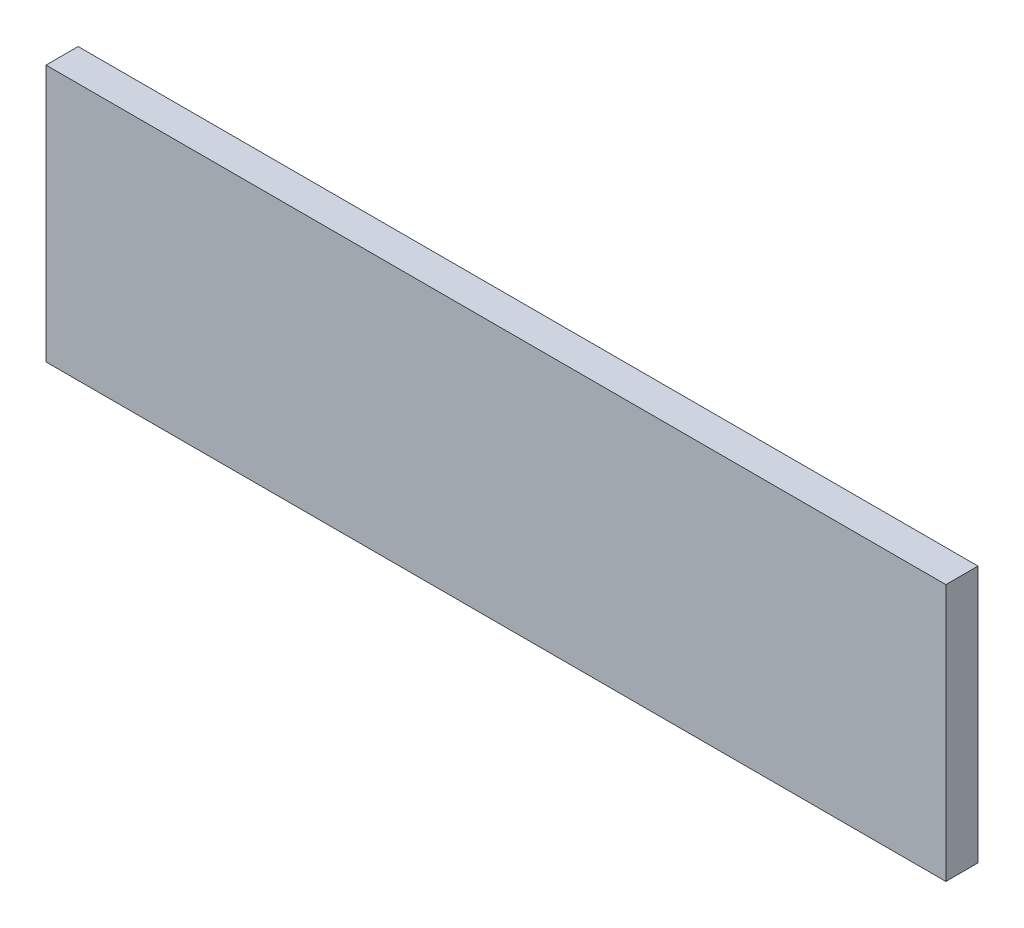
ISO-10303-21;
HEADER;
FILE_DESCRIPTION(('STEP AP214'),'2;1');
FILE_NAME('part.step','',(''),(''),'','','');
FILE_SCHEMA(('AUTOMOTIVE_DESIGN { 1 0 10303 214 1 1 1 1 }'));
ENDSEC;
DATA;
#1=APPLICATION_CONTEXT('core data for automotive mechanical design processes');
#2=APPLICATION_PROTOCOL_DEFINITION('international standard','automotive_design',2000,#1);
#3=PRODUCT_CONTEXT('',#1,'mechanical');
#4=PRODUCT('Part','Part','',(#3));
#5=PRODUCT_RELATED_PRODUCT_CATEGORY('part','',(#4));
#6=PRODUCT_DEFINITION_FORMATION('','',#4);
#7=PRODUCT_DEFINITION_CONTEXT('part definition',#1,'design');
#8=PRODUCT_DEFINITION('design','',#6,#7);
#9=PRODUCT_DEFINITION_SHAPE('','',#8);
#10=(LENGTH_UNIT() NAMED_UNIT(*) SI_UNIT(.MILLI.,.METRE.));
#11=(NAMED_UNIT(*) PLANE_ANGLE_UNIT() SI_UNIT($,.RADIAN.));
#12=(NAMED_UNIT(*) SI_UNIT($,.STERADIAN.) SOLID_ANGLE_UNIT());
#13=UNCERTAINTY_MEASURE_WITH_UNIT(LENGTH_MEASURE(1.E-05),#10,'distance_accuracy_value','');
#14=(GEOMETRIC_REPRESENTATION_CONTEXT(3) GLOBAL_UNCERTAINTY_ASSIGNED_CONTEXT((#13)) GLOBAL_UNIT_ASSIGNED_CONTEXT((#10,
#11,#12)) REPRESENTATION_CONTEXT('',''));
#15=CARTESIAN_POINT('',(0.,0.,0.));
#16=DIRECTION('',(0.,0.,1.));
#17=DIRECTION('',(1.,0.,0.));
#18=AXIS2_PLACEMENT_3D('',#15,#16,#17);
#19=CARTESIAN_POINT('',(0.,0.,-12.7));
#20=DIRECTION('',(-1.,0.,0.));
#21=DIRECTION('',(0.,-1.,0.));
#22=AXIS2_PLACEMENT_3D('',#19,#20,#21);
#23=PLANE('',#22);
#24=DIRECTION('',(0.,-1.,0.));
#25=VECTOR('',#24,1.);
#26=CARTESIAN_POINT('',(0.,0.,0.));
#27=LINE('',#26,#25);
#28=CARTESIAN_POINT('',(0.,101.6,0.));
#29=VERTEX_POINT('',#28);
#30=CARTESIAN_POINT('',(0.,0.,0.));
#31=VERTEX_POINT('',#30);
#32=EDGE_CURVE('E109',#29,#31,#27,.T.);
#33=ORIENTED_EDGE('',*,*,#32,.F.);
#34=DIRECTION('',(0.,0.,1.));
#35=VECTOR('',#34,1.);
#36=CARTESIAN_POINT('',(0.,101.6,-12.7));
#37=LINE('',#36,#35);
#38=CARTESIAN_POINT('',(0.,101.6,-12.7));
#39=VERTEX_POINT('',#38);
#40=EDGE_CURVE('E11',#39,#29,#37,.T.);
#41=ORIENTED_EDGE('',*,*,#40,.F.);
#42=DIRECTION('',(0.,-1.,0.));
#43=VECTOR('',#42,1.);
#44=CARTESIAN_POINT('',(0.,0.,-12.7));
#45=LINE('',#44,#43);
#46=CARTESIAN_POINT('',(0.,0.,-12.7));
#47=VERTEX_POINT('',#46);
#48=EDGE_CURVE('E101',#39,#47,#45,.T.);
#49=ORIENTED_EDGE('',*,*,#48,.T.);
#50=DIRECTION('',(0.,0.,1.));
#51=VECTOR('',#50,1.);
#52=CARTESIAN_POINT('',(0.,0.,-12.7));
#53=LINE('',#52,#51);
#54=EDGE_CURVE('E42',#47,#31,#53,.T.);
#55=ORIENTED_EDGE('',*,*,#54,.T.);
#56=EDGE_LOOP('',(#33,#41,#49,#55));
#57=FACE_BOUND('',#56,.T.);
#58=ADVANCED_FACE('F39',(#57),#23,.T.);
#59=CARTESIAN_POINT('',(0.,101.6,-12.7));
#60=DIRECTION('',(0.,1.,0.));
#61=DIRECTION('',(0.,0.,1.));
#62=AXIS2_PLACEMENT_3D('',#59,#60,#61);
#63=PLANE('',#62);
#64=DIRECTION('',(-1.,0.,0.));
#65=VECTOR('',#64,1.);
#66=CARTESIAN_POINT('',(0.,101.6,0.));
#67=LINE('',#66,#65);
#68=CARTESIAN_POINT('',(355.6,101.6,0.));
#69=VERTEX_POINT('',#68);
#70=EDGE_CURVE('E104',#69,#29,#67,.T.);
#71=ORIENTED_EDGE('',*,*,#70,.F.);
#72=DIRECTION('',(0.,0.,1.));
#73=VECTOR('',#72,1.);
#74=CARTESIAN_POINT('',(355.6,101.6,-12.7));
#75=LINE('',#74,#73);
#76=CARTESIAN_POINT('',(355.6,101.6,-12.7));
#77=VERTEX_POINT('',#76);
#78=EDGE_CURVE('E49',#77,#69,#75,.T.);
#79=ORIENTED_EDGE('',*,*,#78,.F.);
#80=DIRECTION('',(-1.,0.,0.));
#81=VECTOR('',#80,1.);
#82=CARTESIAN_POINT('',(0.,101.6,-12.7));
#83=LINE('',#82,#81);
#84=EDGE_CURVE('E96',#77,#39,#83,.T.);
#85=ORIENTED_EDGE('',*,*,#84,.T.);
#86=ORIENTED_EDGE('',*,*,#40,.T.);
#87=EDGE_LOOP('',(#71,#79,#85,#86));
#88=FACE_BOUND('',#87,.T.);
#89=ADVANCED_FACE('F125',(#88),#63,.T.);
#90=CARTESIAN_POINT('',(355.6,0.,-12.7));
#91=DIRECTION('',(1.,0.,0.));
#92=DIRECTION('',(0.,1.,0.));
#93=AXIS2_PLACEMENT_3D('',#90,#91,#92);
#94=PLANE('',#93);
#95=DIRECTION('',(0.,1.,0.));
#96=VECTOR('',#95,1.);
#97=CARTESIAN_POINT('',(355.6,0.,0.));
#98=LINE('',#97,#96);
#99=CARTESIAN_POINT('',(355.6,0.,0.));
#100=VERTEX_POINT('',#99);
#101=EDGE_CURVE('E90',#100,#69,#98,.T.);
#102=ORIENTED_EDGE('',*,*,#101,.F.);
#103=DIRECTION('',(0.,0.,1.));
#104=VECTOR('',#103,1.);
#105=CARTESIAN_POINT('',(355.6,0.,-12.7));
#106=LINE('',#105,#104);
#107=CARTESIAN_POINT('',(355.6,0.,-12.7));
#108=VERTEX_POINT('',#107);
#109=EDGE_CURVE('E85',#108,#100,#106,.T.);
#110=ORIENTED_EDGE('',*,*,#109,.F.);
#111=DIRECTION('',(0.,1.,0.));
#112=VECTOR('',#111,1.);
#113=CARTESIAN_POINT('',(355.6,0.,-12.7));
#114=LINE('',#113,#112);
#115=EDGE_CURVE('E88',#108,#77,#114,.T.);
#116=ORIENTED_EDGE('',*,*,#115,.T.);
#117=ORIENTED_EDGE('',*,*,#78,.T.);
#118=EDGE_LOOP('',(#102,#110,#116,#117));
#119=FACE_BOUND('',#118,.T.);
#120=ADVANCED_FACE('F87',(#119),#94,.T.);
#121=CARTESIAN_POINT('',(0.,0.,-12.7));
#122=DIRECTION('',(0.,-1.,0.));
#123=DIRECTION('',(0.,0.,-1.));
#124=AXIS2_PLACEMENT_3D('',#121,#122,#123);
#125=PLANE('',#124);
#126=DIRECTION('',(1.,0.,0.));
#127=VECTOR('',#126,1.);
#128=CARTESIAN_POINT('',(0.,0.,0.));
#129=LINE('',#128,#127);
#130=EDGE_CURVE('E113',#31,#100,#129,.T.);
#131=ORIENTED_EDGE('',*,*,#130,.F.);
#132=ORIENTED_EDGE('',*,*,#54,.F.);
#133=DIRECTION('',(1.,0.,0.));
#134=VECTOR('',#133,1.);
#135=CARTESIAN_POINT('',(0.,0.,-12.7));
#136=LINE('',#135,#134);
#137=EDGE_CURVE('E95',#47,#108,#136,.T.);
#138=ORIENTED_EDGE('',*,*,#137,.T.);
#139=ORIENTED_EDGE('',*,*,#109,.T.);
#140=EDGE_LOOP('',(#131,#132,#138,#139));
#141=FACE_BOUND('',#140,.T.);
#142=ADVANCED_FACE('F99',(#141),#125,.T.);
#143=CARTESIAN_POINT('',(0.,0.,-12.7));
#144=DIRECTION('',(0.,0.,-1.));
#145=DIRECTION('',(-1.,0.,0.));
#146=AXIS2_PLACEMENT_3D('',#143,#144,#145);
#147=PLANE('',#146);
#148=ORIENTED_EDGE('',*,*,#48,.F.);
#149=ORIENTED_EDGE('',*,*,#84,.F.);
#150=ORIENTED_EDGE('',*,*,#115,.F.);
#151=ORIENTED_EDGE('',*,*,#137,.F.);
#152=EDGE_LOOP('',(#148,#149,#150,#151));
#153=FACE_BOUND('',#152,.T.);
#154=ADVANCED_FACE('F94',(#153),#147,.T.);
#155=CARTESIAN_POINT('',(0.,0.,0.));
#156=DIRECTION('',(0.,0.,-1.));
#157=DIRECTION('',(-1.,0.,0.));
#158=AXIS2_PLACEMENT_3D('',#155,#156,#157);
#159=PLANE('',#158);
#160=ORIENTED_EDGE('',*,*,#32,.T.);
#161=ORIENTED_EDGE('',*,*,#130,.T.);
#162=ORIENTED_EDGE('',*,*,#101,.T.);
#163=ORIENTED_EDGE('',*,*,#70,.T.);
#164=EDGE_LOOP('',(#160,#161,#162,#163));
#165=FACE_BOUND('',#164,.T.);
#166=ADVANCED_FACE('F124',(#165),#159,.F.);
#167=CLOSED_SHELL('',(#58,#89,#120,#142,#154,#166));
#168=MANIFOLD_SOLID_BREP('B2',#167);
#169=ADVANCED_BREP_SHAPE_REPRESENTATION('',(#18,#168),#14);
#170=SHAPE_DEFINITION_REPRESENTATION(#9,#169);
ENDSEC;
END-ISO-10303-21;
